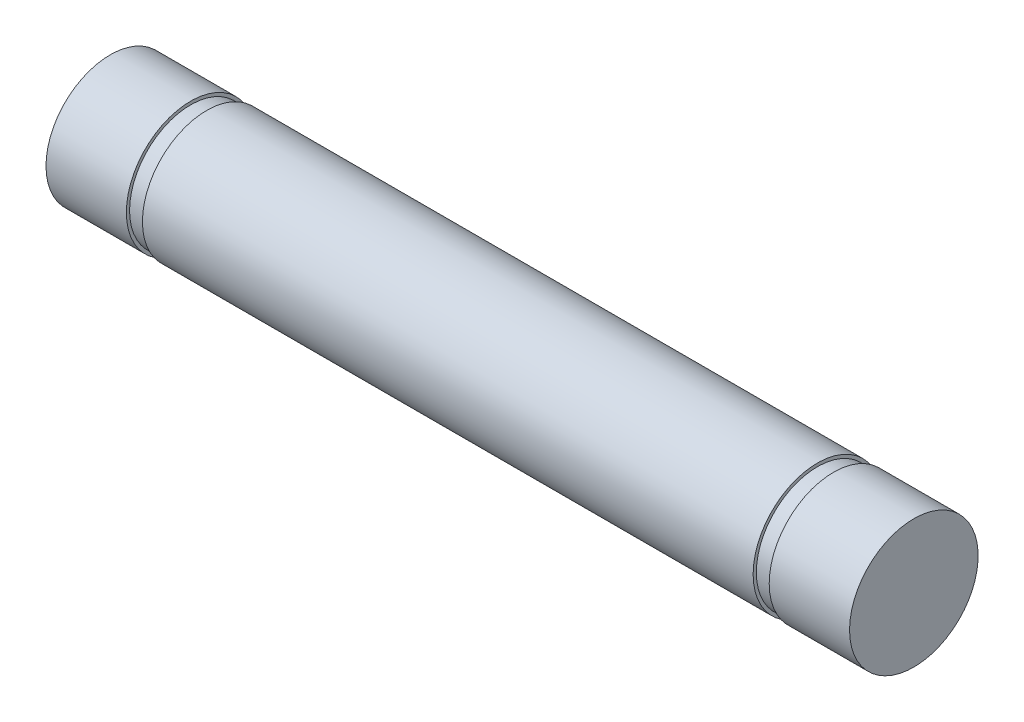
ISO-10303-21;
HEADER;
FILE_DESCRIPTION(('STEP AP214'),'2;1');
FILE_NAME('part.step','',(''),(''),'','','');
FILE_SCHEMA(('AUTOMOTIVE_DESIGN { 1 0 10303 214 1 1 1 1 }'));
ENDSEC;
DATA;
#1=APPLICATION_CONTEXT('core data for automotive mechanical design processes');
#2=APPLICATION_PROTOCOL_DEFINITION('international standard','automotive_design',2000,#1);
#3=PRODUCT_CONTEXT('',#1,'mechanical');
#4=PRODUCT('Part','Part','',(#3));
#5=PRODUCT_RELATED_PRODUCT_CATEGORY('part','',(#4));
#6=PRODUCT_DEFINITION_FORMATION('','',#4);
#7=PRODUCT_DEFINITION_CONTEXT('part definition',#1,'design');
#8=PRODUCT_DEFINITION('design','',#6,#7);
#9=PRODUCT_DEFINITION_SHAPE('','',#8);
#10=(LENGTH_UNIT() NAMED_UNIT(*) SI_UNIT(.MILLI.,.METRE.));
#11=(NAMED_UNIT(*) PLANE_ANGLE_UNIT() SI_UNIT($,.RADIAN.));
#12=(NAMED_UNIT(*) SI_UNIT($,.STERADIAN.) SOLID_ANGLE_UNIT());
#13=UNCERTAINTY_MEASURE_WITH_UNIT(LENGTH_MEASURE(1.E-05),#10,'distance_accuracy_value','');
#14=(GEOMETRIC_REPRESENTATION_CONTEXT(3) GLOBAL_UNCERTAINTY_ASSIGNED_CONTEXT((#13)) GLOBAL_UNIT_ASSIGNED_CONTEXT((#10,
#11,#12)) REPRESENTATION_CONTEXT('',''));
#15=CARTESIAN_POINT('',(0.,0.,0.));
#16=DIRECTION('',(0.,0.,1.));
#17=DIRECTION('',(1.,0.,0.));
#18=AXIS2_PLACEMENT_3D('',#15,#16,#17);
#19=CARTESIAN_POINT('',(0.,0.,0.));
#20=DIRECTION('',(1.,0.,0.));
#21=DIRECTION('',(0.,0.,-1.));
#22=AXIS2_PLACEMENT_3D('',#19,#20,#21);
#23=PLANE('',#22);
#24=CARTESIAN_POINT('',(0.,0.,0.));
#25=DIRECTION('',(-1.,0.,0.));
#26=DIRECTION('',(0.,0.,1.));
#27=AXIS2_PLACEMENT_3D('',#24,#25,#26);
#28=CIRCLE('',#27,2.);
#29=CARTESIAN_POINT('',(0.,0.,2.));
#30=VERTEX_POINT('',#29);
#31=EDGE_CURVE('E10',#30,#30,#28,.T.);
#32=ORIENTED_EDGE('',*,*,#31,.T.);
#33=EDGE_LOOP('',(#32));
#34=FACE_BOUND('',#33,.T.);
#35=ADVANCED_FACE('F33',(#34),#23,.F.);
#36=CARTESIAN_POINT('',(0.,0.,0.));
#37=DIRECTION('',(-1.,0.,0.));
#38=DIRECTION('',(0.,0.,1.));
#39=AXIS2_PLACEMENT_3D('',#36,#37,#38);
#40=CYLINDRICAL_SURFACE('',#39,2.);
#41=ORIENTED_EDGE('',*,*,#31,.F.);
#42=EDGE_LOOP('',(#41));
#43=FACE_BOUND('',#42,.T.);
#44=CARTESIAN_POINT('',(2.5,0.,0.));
#45=DIRECTION('',(-1.,0.,0.));
#46=DIRECTION('',(0.,0.,1.));
#47=AXIS2_PLACEMENT_3D('',#44,#45,#46);
#48=CIRCLE('',#47,2.);
#49=CARTESIAN_POINT('',(2.5,0.,2.));
#50=VERTEX_POINT('',#49);
#51=EDGE_CURVE('E39',#50,#50,#48,.T.);
#52=ORIENTED_EDGE('',*,*,#51,.T.);
#53=EDGE_LOOP('',(#52));
#54=FACE_BOUND('',#53,.T.);
#55=ADVANCED_FACE('F83',(#43,#54),#40,.T.);
#56=CARTESIAN_POINT('',(2.5,1.9,0.));
#57=DIRECTION('',(-1.,0.,0.));
#58=DIRECTION('',(0.,0.,1.));
#59=AXIS2_PLACEMENT_3D('',#56,#57,#58);
#60=PLANE('',#59);
#61=ORIENTED_EDGE('',*,*,#51,.F.);
#62=EDGE_LOOP('',(#61));
#63=FACE_BOUND('',#62,.T.);
#64=CARTESIAN_POINT('',(2.5,0.,0.));
#65=DIRECTION('',(-1.,0.,0.));
#66=DIRECTION('',(0.,0.,1.));
#67=AXIS2_PLACEMENT_3D('',#64,#65,#66);
#68=CIRCLE('',#67,1.9);
#69=CARTESIAN_POINT('',(2.5,0.,1.9));
#70=VERTEX_POINT('',#69);
#71=EDGE_CURVE('E43',#70,#70,#68,.T.);
#72=ORIENTED_EDGE('',*,*,#71,.T.);
#73=EDGE_LOOP('',(#72));
#74=FACE_BOUND('',#73,.T.);
#75=ADVANCED_FACE('F87',(#63,#74),#60,.F.);
#76=CARTESIAN_POINT('',(0.,0.,0.));
#77=DIRECTION('',(-1.,0.,0.));
#78=DIRECTION('',(0.,0.,1.));
#79=AXIS2_PLACEMENT_3D('',#76,#77,#78);
#80=CYLINDRICAL_SURFACE('',#79,1.9);
#81=ORIENTED_EDGE('',*,*,#71,.F.);
#82=EDGE_LOOP('',(#81));
#83=FACE_BOUND('',#82,.T.);
#84=CARTESIAN_POINT('',(3.,0.,0.));
#85=DIRECTION('',(-1.,0.,0.));
#86=DIRECTION('',(0.,0.,1.));
#87=AXIS2_PLACEMENT_3D('',#84,#85,#86);
#88=CIRCLE('',#87,1.9);
#89=CARTESIAN_POINT('',(3.,0.,1.9));
#90=VERTEX_POINT('',#89);
#91=EDGE_CURVE('E47',#90,#90,#88,.T.);
#92=ORIENTED_EDGE('',*,*,#91,.T.);
#93=EDGE_LOOP('',(#92));
#94=FACE_BOUND('',#93,.T.);
#95=ADVANCED_FACE('F92',(#83,#94),#80,.T.);
#96=CARTESIAN_POINT('',(3.,1.9,0.));
#97=DIRECTION('',(1.,0.,0.));
#98=DIRECTION('',(0.,0.,-1.));
#99=AXIS2_PLACEMENT_3D('',#96,#97,#98);
#100=PLANE('',#99);
#101=ORIENTED_EDGE('',*,*,#91,.F.);
#102=EDGE_LOOP('',(#101));
#103=FACE_BOUND('',#102,.T.);
#104=CARTESIAN_POINT('',(3.,0.,0.));
#105=DIRECTION('',(-1.,0.,0.));
#106=DIRECTION('',(0.,0.,1.));
#107=AXIS2_PLACEMENT_3D('',#104,#105,#106);
#108=CIRCLE('',#107,2.);
#109=CARTESIAN_POINT('',(3.,0.,2.));
#110=VERTEX_POINT('',#109);
#111=EDGE_CURVE('E52',#110,#110,#108,.T.);
#112=ORIENTED_EDGE('',*,*,#111,.T.);
#113=EDGE_LOOP('',(#112));
#114=FACE_BOUND('',#113,.T.);
#115=ADVANCED_FACE('F98',(#103,#114),#100,.F.);
#116=CARTESIAN_POINT('',(0.,0.,0.));
#117=DIRECTION('',(-1.,0.,0.));
#118=DIRECTION('',(0.,0.,1.));
#119=AXIS2_PLACEMENT_3D('',#116,#117,#118);
#120=CYLINDRICAL_SURFACE('',#119,2.);
#121=ORIENTED_EDGE('',*,*,#111,.F.);
#122=EDGE_LOOP('',(#121));
#123=FACE_BOUND('',#122,.T.);
#124=CARTESIAN_POINT('',(22.,0.,0.));
#125=DIRECTION('',(-1.,0.,0.));
#126=DIRECTION('',(0.,0.,1.));
#127=AXIS2_PLACEMENT_3D('',#124,#125,#126);
#128=CIRCLE('',#127,2.);
#129=CARTESIAN_POINT('',(22.,0.,2.));
#130=VERTEX_POINT('',#129);
#131=EDGE_CURVE('E55',#130,#130,#128,.T.);
#132=ORIENTED_EDGE('',*,*,#131,.T.);
#133=EDGE_LOOP('',(#132));
#134=FACE_BOUND('',#133,.T.);
#135=ADVANCED_FACE('F102',(#123,#134),#120,.T.);
#136=CARTESIAN_POINT('',(22.,1.9,0.));
#137=DIRECTION('',(-1.,0.,0.));
#138=DIRECTION('',(0.,0.,1.));
#139=AXIS2_PLACEMENT_3D('',#136,#137,#138);
#140=PLANE('',#139);
#141=ORIENTED_EDGE('',*,*,#131,.F.);
#142=EDGE_LOOP('',(#141));
#143=FACE_BOUND('',#142,.T.);
#144=CARTESIAN_POINT('',(22.,0.,0.));
#145=DIRECTION('',(-1.,0.,0.));
#146=DIRECTION('',(0.,0.,1.));
#147=AXIS2_PLACEMENT_3D('',#144,#145,#146);
#148=CIRCLE('',#147,1.9);
#149=CARTESIAN_POINT('',(22.,0.,1.9));
#150=VERTEX_POINT('',#149);
#151=EDGE_CURVE('E58',#150,#150,#148,.T.);
#152=ORIENTED_EDGE('',*,*,#151,.T.);
#153=EDGE_LOOP('',(#152));
#154=FACE_BOUND('',#153,.T.);
#155=ADVANCED_FACE('F106',(#143,#154),#140,.F.);
#156=CARTESIAN_POINT('',(0.,0.,0.));
#157=DIRECTION('',(-1.,0.,0.));
#158=DIRECTION('',(0.,0.,1.));
#159=AXIS2_PLACEMENT_3D('',#156,#157,#158);
#160=CYLINDRICAL_SURFACE('',#159,1.9);
#161=ORIENTED_EDGE('',*,*,#151,.F.);
#162=EDGE_LOOP('',(#161));
#163=FACE_BOUND('',#162,.T.);
#164=CARTESIAN_POINT('',(22.5,0.,0.));
#165=DIRECTION('',(-1.,0.,0.));
#166=DIRECTION('',(0.,0.,1.));
#167=AXIS2_PLACEMENT_3D('',#164,#165,#166);
#168=CIRCLE('',#167,1.9);
#169=CARTESIAN_POINT('',(22.5,0.,1.9));
#170=VERTEX_POINT('',#169);
#171=EDGE_CURVE('E61',#170,#170,#168,.T.);
#172=ORIENTED_EDGE('',*,*,#171,.T.);
#173=EDGE_LOOP('',(#172));
#174=FACE_BOUND('',#173,.T.);
#175=ADVANCED_FACE('F110',(#163,#174),#160,.T.);
#176=CARTESIAN_POINT('',(22.5,1.9,0.));
#177=DIRECTION('',(1.,0.,0.));
#178=DIRECTION('',(0.,0.,-1.));
#179=AXIS2_PLACEMENT_3D('',#176,#177,#178);
#180=PLANE('',#179);
#181=ORIENTED_EDGE('',*,*,#171,.F.);
#182=EDGE_LOOP('',(#181));
#183=FACE_BOUND('',#182,.T.);
#184=CARTESIAN_POINT('',(22.5,0.,0.));
#185=DIRECTION('',(-1.,0.,0.));
#186=DIRECTION('',(0.,0.,1.));
#187=AXIS2_PLACEMENT_3D('',#184,#185,#186);
#188=CIRCLE('',#187,2.);
#189=CARTESIAN_POINT('',(22.5,0.,2.));
#190=VERTEX_POINT('',#189);
#191=EDGE_CURVE('E64',#190,#190,#188,.T.);
#192=ORIENTED_EDGE('',*,*,#191,.T.);
#193=EDGE_LOOP('',(#192));
#194=FACE_BOUND('',#193,.T.);
#195=ADVANCED_FACE('F79',(#183,#194),#180,.F.);
#196=CARTESIAN_POINT('',(0.,0.,0.));
#197=DIRECTION('',(-1.,0.,0.));
#198=DIRECTION('',(0.,0.,1.));
#199=AXIS2_PLACEMENT_3D('',#196,#197,#198);
#200=CYLINDRICAL_SURFACE('',#199,2.);
#201=ORIENTED_EDGE('',*,*,#191,.F.);
#202=EDGE_LOOP('',(#201));
#203=FACE_BOUND('',#202,.T.);
#204=CARTESIAN_POINT('',(25.,0.,0.));
#205=DIRECTION('',(-1.,0.,0.));
#206=DIRECTION('',(0.,0.,1.));
#207=AXIS2_PLACEMENT_3D('',#204,#205,#206);
#208=CIRCLE('',#207,2.);
#209=CARTESIAN_POINT('',(25.,0.,2.));
#210=VERTEX_POINT('',#209);
#211=EDGE_CURVE('E67',#210,#210,#208,.T.);
#212=ORIENTED_EDGE('',*,*,#211,.T.);
#213=EDGE_LOOP('',(#212));
#214=FACE_BOUND('',#213,.T.);
#215=ADVANCED_FACE('F71',(#203,#214),#200,.T.);
#216=CARTESIAN_POINT('',(25.,0.,0.));
#217=DIRECTION('',(-1.,0.,0.));
#218=DIRECTION('',(0.,0.,1.));
#219=AXIS2_PLACEMENT_3D('',#216,#217,#218);
#220=PLANE('',#219);
#221=ORIENTED_EDGE('',*,*,#211,.F.);
#222=EDGE_LOOP('',(#221));
#223=FACE_BOUND('',#222,.T.);
#224=ADVANCED_FACE('F73',(#223),#220,.F.);
#225=CLOSED_SHELL('',(#35,#55,#75,#95,#115,#135,#155,#175,#195,#215,#224));
#226=MANIFOLD_SOLID_BREP('B2',#225);
#227=ADVANCED_BREP_SHAPE_REPRESENTATION('',(#18,#226),#14);
#228=SHAPE_DEFINITION_REPRESENTATION(#9,#227);
ENDSEC;
END-ISO-10303-21;
